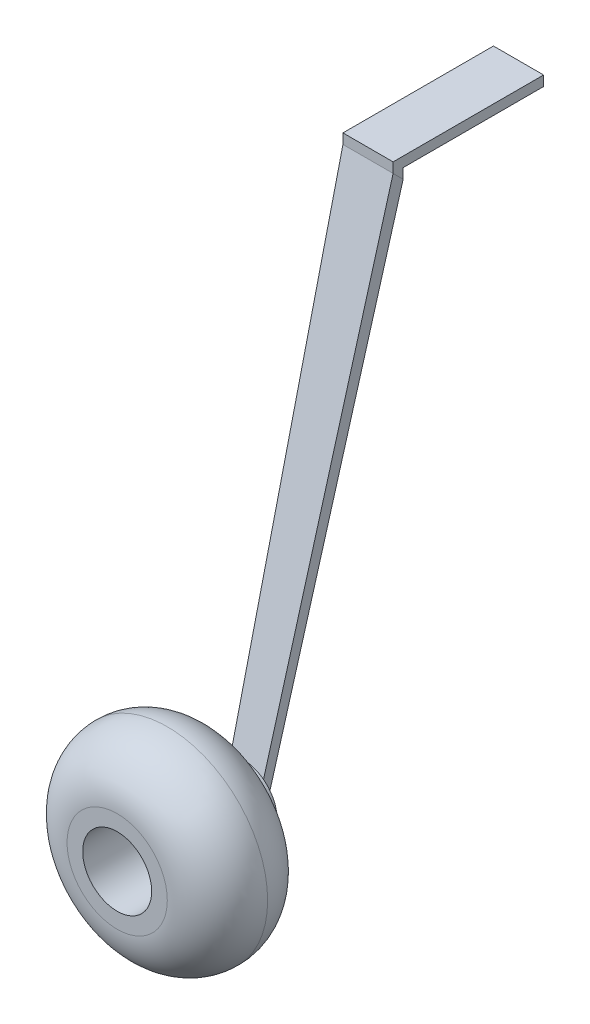
ISO-10303-21;
HEADER;
FILE_DESCRIPTION(('STEP AP214'),'2;1');
FILE_NAME('part.step','',(''),(''),'','','');
FILE_SCHEMA(('AUTOMOTIVE_DESIGN { 1 0 10303 214 1 1 1 1 }'));
ENDSEC;
DATA;
#1=APPLICATION_CONTEXT('core data for automotive mechanical design processes');
#2=APPLICATION_PROTOCOL_DEFINITION('international standard','automotive_design',2000,#1);
#3=PRODUCT_CONTEXT('',#1,'mechanical');
#4=PRODUCT('Part','Part','',(#3));
#5=PRODUCT_RELATED_PRODUCT_CATEGORY('part','',(#4));
#6=PRODUCT_DEFINITION_FORMATION('','',#4);
#7=PRODUCT_DEFINITION_CONTEXT('part definition',#1,'design');
#8=PRODUCT_DEFINITION('design','',#6,#7);
#9=PRODUCT_DEFINITION_SHAPE('','',#8);
#10=(LENGTH_UNIT() NAMED_UNIT(*) SI_UNIT(.MILLI.,.METRE.));
#11=(NAMED_UNIT(*) PLANE_ANGLE_UNIT() SI_UNIT($,.RADIAN.));
#12=(NAMED_UNIT(*) SI_UNIT($,.STERADIAN.) SOLID_ANGLE_UNIT());
#13=UNCERTAINTY_MEASURE_WITH_UNIT(LENGTH_MEASURE(1.E-05),#10,'distance_accuracy_value','');
#14=(GEOMETRIC_REPRESENTATION_CONTEXT(3) GLOBAL_UNCERTAINTY_ASSIGNED_CONTEXT((#13)) GLOBAL_UNIT_ASSIGNED_CONTEXT((#10,
#11,#12)) REPRESENTATION_CONTEXT('',''));
#15=CARTESIAN_POINT('',(0.,0.,0.));
#16=DIRECTION('',(0.,0.,1.));
#17=DIRECTION('',(1.,0.,0.));
#18=AXIS2_PLACEMENT_3D('',#15,#16,#17);
#19=CARTESIAN_POINT('',(0.,0.,35.));
#20=DIRECTION('',(0.,0.,-1.));
#21=DIRECTION('',(1.,0.,0.));
#22=AXIS2_PLACEMENT_3D('',#19,#20,#21);
#23=PLANE('',#22);
#24=CARTESIAN_POINT('',(0.,0.,35.));
#25=DIRECTION('',(0.,0.,1.));
#26=DIRECTION('',(1.,0.,0.));
#27=AXIS2_PLACEMENT_3D('',#24,#25,#26);
#28=CIRCLE('',#27,6.87563698641834);
#29=CARTESIAN_POINT('',(6.87563698641834,0.,35.));
#30=VERTEX_POINT('',#29);
#31=EDGE_CURVE('E12',#30,#30,#28,.T.);
#32=ORIENTED_EDGE('',*,*,#31,.F.);
#33=EDGE_LOOP('',(#32));
#34=FACE_BOUND('',#33,.T.);
#35=DIRECTION('',(1.,0.,0.));
#36=VECTOR('',#35,1.);
#37=CARTESIAN_POINT('',(-3.32337252316547,-1.61552830987186,35.));
#38=LINE('',#37,#36);
#39=CARTESIAN_POINT('',(-3.32337252316547,-1.61552830987186,35.));
#40=VERTEX_POINT('',#39);
#41=CARTESIAN_POINT('',(3.32337252316547,-1.61552830987186,35.));
#42=VERTEX_POINT('',#41);
#43=EDGE_CURVE('E244',#40,#42,#38,.T.);
#44=ORIENTED_EDGE('',*,*,#43,.T.);
#45=DIRECTION('',(0.,1.,0.));
#46=VECTOR('',#45,1.);
#47=CARTESIAN_POINT('',(3.32337252316547,-1.61552830987186,35.));
#48=LINE('',#47,#46);
#49=CARTESIAN_POINT('',(3.32337252316547,1.61552830987186,35.));
#50=VERTEX_POINT('',#49);
#51=EDGE_CURVE('E248',#42,#50,#48,.T.);
#52=ORIENTED_EDGE('',*,*,#51,.T.);
#53=DIRECTION('',(1.,0.,0.));
#54=VECTOR('',#53,1.);
#55=CARTESIAN_POINT('',(0.,1.61552830987186,35.));
#56=LINE('',#55,#54);
#57=CARTESIAN_POINT('',(-3.32337252316547,1.61552830987187,35.));
#58=VERTEX_POINT('',#57);
#59=EDGE_CURVE('E256',#58,#50,#56,.T.);
#60=ORIENTED_EDGE('',*,*,#59,.F.);
#61=DIRECTION('',(0.,1.,0.));
#62=VECTOR('',#61,1.);
#63=CARTESIAN_POINT('',(-3.32337252316547,-1.61552830987186,35.));
#64=LINE('',#63,#62);
#65=EDGE_CURVE('E261',#40,#58,#64,.T.);
#66=ORIENTED_EDGE('',*,*,#65,.F.);
#67=EDGE_LOOP('',(#44,#52,#60,#66));
#68=FACE_BOUND('',#67,.T.);
#69=ADVANCED_FACE('F63',(#34,#68),#23,.T.);
#70=CARTESIAN_POINT('',(0.,0.,35.));
#71=DIRECTION('',(0.,0.,1.));
#72=DIRECTION('',(-1.,0.,0.));
#73=AXIS2_PLACEMENT_3D('',#70,#71,#72);
#74=CYLINDRICAL_SURFACE('',#73,6.87563698641834);
#75=ORIENTED_EDGE('',*,*,#31,.T.);
#76=EDGE_LOOP('',(#75));
#77=FACE_BOUND('',#76,.T.);
#78=CARTESIAN_POINT('',(0.,0.,40.));
#79=DIRECTION('',(0.,0.,1.));
#80=DIRECTION('',(1.,0.,0.));
#81=AXIS2_PLACEMENT_3D('',#78,#79,#80);
#82=CIRCLE('',#81,6.87563698641834);
#83=CARTESIAN_POINT('',(6.87563698641834,0.,40.));
#84=VERTEX_POINT('',#83);
#85=EDGE_CURVE('E75',#84,#84,#82,.T.);
#86=ORIENTED_EDGE('',*,*,#85,.F.);
#87=EDGE_LOOP('',(#86));
#88=FACE_BOUND('',#87,.T.);
#89=ADVANCED_FACE('F65',(#77,#88),#74,.T.);
#90=CARTESIAN_POINT('',(0.,0.,40.));
#91=DIRECTION('',(0.,0.,-1.));
#92=DIRECTION('',(1.,0.,0.));
#93=AXIS2_PLACEMENT_3D('',#90,#91,#92);
#94=PLANE('',#93);
#95=ORIENTED_EDGE('',*,*,#85,.T.);
#96=EDGE_LOOP('',(#95));
#97=FACE_BOUND('',#96,.T.);
#98=ADVANCED_FACE('F379',(#97),#94,.F.);
#99=CARTESIAN_POINT('',(-3.32337252316547,-1.61552830987186,33.));
#100=DIRECTION('',(-1.,0.,0.));
#101=DIRECTION('',(0.,0.,-1.));
#102=AXIS2_PLACEMENT_3D('',#99,#100,#101);
#103=PLANE('',#102);
#104=ORIENTED_EDGE('',*,*,#65,.T.);
#105=DIRECTION('',(0.,0.,-1.));
#106=VECTOR('',#105,1.);
#107=CARTESIAN_POINT('',(-3.32337252316547,1.61552830987186,33.));
#108=LINE('',#107,#106);
#109=CARTESIAN_POINT('',(-3.32337252316547,1.61552830987185,33.));
#110=VERTEX_POINT('',#109);
#111=EDGE_CURVE('E242',#110,#58,#108,.F.);
#112=ORIENTED_EDGE('',*,*,#111,.F.);
#113=DIRECTION('',(0.,1.,0.));
#114=VECTOR('',#113,1.);
#115=CARTESIAN_POINT('',(-3.32337252316547,-1.61552830987186,33.));
#116=LINE('',#115,#114);
#117=CARTESIAN_POINT('',(-3.32337252316547,-1.61552830987186,33.));
#118=VERTEX_POINT('',#117);
#119=EDGE_CURVE('E247',#118,#110,#116,.T.);
#120=ORIENTED_EDGE('',*,*,#119,.F.);
#121=DIRECTION('',(0.,0.,1.));
#122=VECTOR('',#121,1.);
#123=CARTESIAN_POINT('',(-3.32337252316547,-1.61552830987186,33.));
#124=LINE('',#123,#122);
#125=EDGE_CURVE('E249',#118,#40,#124,.T.);
#126=ORIENTED_EDGE('',*,*,#125,.T.);
#127=EDGE_LOOP('',(#104,#112,#120,#126));
#128=FACE_BOUND('',#127,.T.);
#129=ADVANCED_FACE('F365',(#128),#103,.T.);
#130=CARTESIAN_POINT('',(-3.32337252316547,-1.61552830987186,33.));
#131=DIRECTION('',(0.,1.,0.));
#132=DIRECTION('',(0.,0.,-1.));
#133=AXIS2_PLACEMENT_3D('',#130,#131,#132);
#134=PLANE('',#133);
#135=ORIENTED_EDGE('',*,*,#43,.F.);
#136=ORIENTED_EDGE('',*,*,#125,.F.);
#137=DIRECTION('',(1.,0.,0.));
#138=VECTOR('',#137,1.);
#139=CARTESIAN_POINT('',(-3.32337252316547,-1.61552830987186,33.));
#140=LINE('',#139,#138);
#141=CARTESIAN_POINT('',(3.32337252316547,-1.61552830987186,33.));
#142=VERTEX_POINT('',#141);
#143=EDGE_CURVE('E235',#118,#142,#140,.T.);
#144=ORIENTED_EDGE('',*,*,#143,.T.);
#145=DIRECTION('',(0.,0.,1.));
#146=VECTOR('',#145,1.);
#147=CARTESIAN_POINT('',(3.32337252316547,-1.61552830987186,33.));
#148=LINE('',#147,#146);
#149=EDGE_CURVE('E111',#142,#42,#148,.T.);
#150=ORIENTED_EDGE('',*,*,#149,.T.);
#151=EDGE_LOOP('',(#135,#136,#144,#150));
#152=FACE_BOUND('',#151,.T.);
#153=ADVANCED_FACE('F371',(#152),#134,.F.);
#154=CARTESIAN_POINT('',(3.32337252316547,-1.61552830987186,33.));
#155=DIRECTION('',(-1.,0.,0.));
#156=DIRECTION('',(0.,0.,-1.));
#157=AXIS2_PLACEMENT_3D('',#154,#155,#156);
#158=PLANE('',#157);
#159=ORIENTED_EDGE('',*,*,#51,.F.);
#160=ORIENTED_EDGE('',*,*,#149,.F.);
#161=DIRECTION('',(0.,1.,0.));
#162=VECTOR('',#161,1.);
#163=CARTESIAN_POINT('',(3.32337252316547,-1.61552830987186,33.));
#164=LINE('',#163,#162);
#165=CARTESIAN_POINT('',(3.32337252316547,1.61552830987186,33.));
#166=VERTEX_POINT('',#165);
#167=EDGE_CURVE('E243',#142,#166,#164,.T.);
#168=ORIENTED_EDGE('',*,*,#167,.T.);
#169=DIRECTION('',(0.,0.,-1.));
#170=VECTOR('',#169,1.);
#171=CARTESIAN_POINT('',(3.32337252316547,1.61552830987186,33.));
#172=LINE('',#171,#170);
#173=EDGE_CURVE('E187',#166,#50,#172,.F.);
#174=ORIENTED_EDGE('',*,*,#173,.T.);
#175=EDGE_LOOP('',(#159,#160,#168,#174));
#176=FACE_BOUND('',#175,.T.);
#177=ADVANCED_FACE('F369',(#176),#158,.F.);
#178=CARTESIAN_POINT('',(0.,0.,33.));
#179=DIRECTION('',(0.,0.,1.));
#180=DIRECTION('',(-1.,0.,0.));
#181=AXIS2_PLACEMENT_3D('',#178,#179,#180);
#182=PLANE('',#181);
#183=ORIENTED_EDGE('',*,*,#119,.T.);
#184=DIRECTION('',(1.,0.,0.));
#185=VECTOR('',#184,1.);
#186=CARTESIAN_POINT('',(0.,1.61552830987186,33.));
#187=LINE('',#186,#185);
#188=EDGE_CURVE('E258',#110,#166,#187,.T.);
#189=ORIENTED_EDGE('',*,*,#188,.T.);
#190=ORIENTED_EDGE('',*,*,#167,.F.);
#191=ORIENTED_EDGE('',*,*,#143,.F.);
#192=EDGE_LOOP('',(#183,#189,#190,#191));
#193=FACE_BOUND('',#192,.T.);
#194=ADVANCED_FACE('F213',(#193),#182,.F.);
#195=CARTESIAN_POINT('',(0.,18.3289163667286,30.6649168263873));
#196=DIRECTION('',(0.,-0.251069747404583,-0.967968998438586));
#197=DIRECTION('',(0.,-0.967968998438586,0.251069747404583));
#198=AXIS2_PLACEMENT_3D('',#195,#196,#197);
#199=PLANE('',#198);
#200=DIRECTION('',(-0.0168356310439238,0.967831808889454,-0.251034163470074));
#201=VECTOR('',#200,1.);
#202=CARTESIAN_POINT('',(-3.32337252316547,1.61552830987186,35.));
#203=LINE('',#202,#201);
#204=CARTESIAN_POINT('',(-4.99999999999999,98.,10.));
#205=VERTEX_POINT('',#204);
#206=EDGE_CURVE('E84',#58,#205,#203,.T.);
#207=ORIENTED_EDGE('',*,*,#206,.F.);
#208=ORIENTED_EDGE('',*,*,#59,.T.);
#209=DIRECTION('',(0.016835631043924,0.967831808889454,-0.251034163470074));
#210=VECTOR('',#209,1.);
#211=CARTESIAN_POINT('',(3.32337252316547,1.61552830987186,35.));
#212=LINE('',#211,#210);
#213=CARTESIAN_POINT('',(5.00000000000002,98.,10.));
#214=VERTEX_POINT('',#213);
#215=EDGE_CURVE('E190',#50,#214,#212,.T.);
#216=ORIENTED_EDGE('',*,*,#215,.T.);
#217=CARTESIAN_POINT('',(5.00000000000002,98.,9.99999999999998));
#218=DIRECTION('',(-1.,0.,0.));
#219=VECTOR('',#218,1.);
#220=LINE('',#217,#219);
#221=EDGE_CURVE('E199',#214,#205,#220,.T.);
#222=ORIENTED_EDGE('',*,*,#221,.T.);
#223=EDGE_LOOP('',(#207,#208,#216,#222));
#224=FACE_BOUND('',#223,.T.);
#225=ADVANCED_FACE('F204',(#224),#199,.F.);
#226=CARTESIAN_POINT('',(3.32337252316547,1.61552830987186,33.));
#227=CARTESIAN_POINT('',(5.,96.,8.00000000000001));
#228=CARTESIAN_POINT('',(3.32337252316547,1.61552830987186,33.3333333333334));
#229=CARTESIAN_POINT('',(5.,96.3333333333333,8.33333333333331));
#230=CARTESIAN_POINT('',(3.32337252316547,1.61552830987186,33.6666666666668));
#231=CARTESIAN_POINT('',(5.,96.6666666666666,8.66666666666663));
#232=CARTESIAN_POINT('',(3.32337252316547,1.61552830987186,34.3333333333334));
#233=CARTESIAN_POINT('',(5.,97.3333333333333,9.3333333333333));
#234=CARTESIAN_POINT('',(3.32337252316547,1.61552830987186,34.6666666666667));
#235=CARTESIAN_POINT('',(5.,97.6666666666666,9.66666666666665));
#236=CARTESIAN_POINT('',(3.32337252316547,1.61552830987186,35.));
#237=CARTESIAN_POINT('',(5.,98.,10.));
#238=B_SPLINE_SURFACE_WITH_KNOTS('',3,1,((#226,#227),(#228,#229),(#230,#231),(#232,#233),(#234,
#235),(#236,#237)),.UNSPECIFIED.,.F.,.F.,.F.,(4,2,4),(2,2),(0.,0.5,1.),(0.,1.),.UNSPECIFIED.);
#239=DIRECTION('',(0.017169118676803,0.96652250907558,-0.25600675931332));
#240=VECTOR('',#239,1.);
#241=CARTESIAN_POINT('',(3.32337252316547,1.61552830987186,33.));
#242=LINE('',#241,#240);
#243=CARTESIAN_POINT('',(5.,96.,8.00000000000001));
#244=VERTEX_POINT('',#243);
#245=EDGE_CURVE('E170',#166,#244,#242,.T.);
#246=CARTESIAN_POINT('',(5.,96.,8.00000000000001));
#247=CARTESIAN_POINT('',(5.,96.3333333333333,8.33333333333331));
#248=CARTESIAN_POINT('',(5.,96.6666666666666,8.66666666666663));
#249=CARTESIAN_POINT('',(5.,97.3333333333333,9.3333333333333));
#250=CARTESIAN_POINT('',(5.,97.6666666666666,9.66666666666665));
#251=CARTESIAN_POINT('',(5.,98.,10.));
#252=B_SPLINE_CURVE_WITH_KNOTS('',3,(#246,#247,#248,#249,#250,#251),.UNSPECIFIED.,.F.,.F.,(4,2,
4),(0.,0.5,1.),.UNSPECIFIED.);
#253=EDGE_CURVE('E173',#214,#244,#252,.F.);
#254=ORIENTED_EDGE('',*,*,#173,.F.);
#255=ORIENTED_EDGE('',*,*,#245,.T.);
#256=ORIENTED_EDGE('',*,*,#253,.F.);
#257=ORIENTED_EDGE('',*,*,#215,.F.);
#258=EDGE_LOOP('',(#254,#255,#256,#257));
#259=FACE_BOUND('',#258,.T.);
#260=ADVANCED_FACE('F185',(#259),#238,.F.);
#261=CARTESIAN_POINT('',(-3.32337252316547,1.61552830987186,35.));
#262=CARTESIAN_POINT('',(-4.99999999999999,98.,10.));
#263=CARTESIAN_POINT('',(-3.32337252316547,1.61552830987186,34.6666666666666));
#264=CARTESIAN_POINT('',(-4.99999999999999,97.6666666666666,9.66666666666664));
#265=CARTESIAN_POINT('',(-3.32337252316547,1.61552830987186,34.3333333333333));
#266=CARTESIAN_POINT('',(-4.99999999999999,97.3333333333333,9.3333333333333));
#267=CARTESIAN_POINT('',(-3.32337252316547,1.61552830987186,33.6666666666666));
#268=CARTESIAN_POINT('',(-4.99999999999999,96.6666666666666,8.66666666666663));
#269=CARTESIAN_POINT('',(-3.32337252316547,1.61552830987186,33.3333333333333));
#270=CARTESIAN_POINT('',(-4.99999999999999,96.3333333333333,8.33333333333331));
#271=CARTESIAN_POINT('',(-3.32337252316547,1.61552830987186,33.));
#272=CARTESIAN_POINT('',(-4.99999999999999,96.,8.00000000000001));
#273=B_SPLINE_SURFACE_WITH_KNOTS('',3,1,((#261,#262),(#263,#264),(#265,#266),(#267,#268),(#269,
#270),(#271,#272)),.UNSPECIFIED.,.F.,.F.,.F.,(4,2,4),(2,2),(0.,0.5,1.),(0.,1.),.UNSPECIFIED.);
#274=CARTESIAN_POINT('',(-4.99999999999999,98.,10.));
#275=CARTESIAN_POINT('',(-4.99999999999999,97.6666666666666,9.66666666666664));
#276=CARTESIAN_POINT('',(-4.99999999999999,97.3333333333333,9.3333333333333));
#277=CARTESIAN_POINT('',(-4.99999999999999,96.6666666666666,8.66666666666663));
#278=CARTESIAN_POINT('',(-4.99999999999999,96.3333333333333,8.33333333333331));
#279=CARTESIAN_POINT('',(-4.99999999999999,96.,8.00000000000001));
#280=B_SPLINE_CURVE_WITH_KNOTS('',3,(#274,#275,#276,#277,#278,#279),.UNSPECIFIED.,.F.,.F.,(4,2,
4),(0.,0.5,1.),.UNSPECIFIED.);
#281=CARTESIAN_POINT('',(-4.99999999999999,96.,8.00000000000001));
#282=VERTEX_POINT('',#281);
#283=EDGE_CURVE('E172',#282,#205,#280,.F.);
#284=DIRECTION('',(-0.0171691186768029,0.96652250907558,-0.25600675931332));
#285=VECTOR('',#284,1.);
#286=CARTESIAN_POINT('',(-4.16168626158273,48.8077641549359,20.5));
#287=LINE('',#286,#285);
#288=EDGE_CURVE('E101',#110,#282,#287,.T.);
#289=ORIENTED_EDGE('',*,*,#111,.T.);
#290=ORIENTED_EDGE('',*,*,#206,.T.);
#291=ORIENTED_EDGE('',*,*,#283,.F.);
#292=ORIENTED_EDGE('',*,*,#288,.F.);
#293=EDGE_LOOP('',(#289,#290,#291,#292));
#294=FACE_BOUND('',#293,.T.);
#295=ADVANCED_FACE('F221',(#294),#273,.F.);
#296=CARTESIAN_POINT('',(0.,18.174087747841,28.6140668212002));
#297=DIRECTION('',(0.,0.256044500319133,0.966664995671368));
#298=DIRECTION('',(0.,0.966664995671368,-0.256044500319133));
#299=AXIS2_PLACEMENT_3D('',#296,#297,#298);
#300=PLANE('',#299);
#301=ORIENTED_EDGE('',*,*,#245,.F.);
#302=ORIENTED_EDGE('',*,*,#188,.F.);
#303=ORIENTED_EDGE('',*,*,#288,.T.);
#304=CARTESIAN_POINT('',(-4.99999999999999,96.,8.00000000000001));
#305=DIRECTION('',(1.,0.,0.));
#306=VECTOR('',#305,1.);
#307=LINE('',#304,#306);
#308=EDGE_CURVE('E156',#282,#244,#307,.T.);
#309=ORIENTED_EDGE('',*,*,#308,.T.);
#310=EDGE_LOOP('',(#301,#302,#303,#309));
#311=FACE_BOUND('',#310,.T.);
#312=ADVANCED_FACE('F168',(#311),#300,.F.);
#313=CARTESIAN_POINT('',(0.,98.,-40.));
#314=DIRECTION('',(0.,-1.,0.));
#315=DIRECTION('',(0.,0.,1.));
#316=AXIS2_PLACEMENT_3D('',#313,#314,#315);
#317=PLANE('',#316);
#318=DIRECTION('',(0.,0.,1.));
#319=VECTOR('',#318,1.);
#320=CARTESIAN_POINT('',(-4.99999999999999,98.,-9.99999999999999));
#321=LINE('',#320,#319);
#322=CARTESIAN_POINT('',(-4.99999999999999,98.,-20.));
#323=VERTEX_POINT('',#322);
#324=CARTESIAN_POINT('',(-5.,98.,8.00000000000001));
#325=VERTEX_POINT('',#324);
#326=EDGE_CURVE('E331',#323,#325,#321,.T.);
#327=ORIENTED_EDGE('',*,*,#326,.F.);
#328=DIRECTION('',(1.,0.,0.));
#329=VECTOR('',#328,1.);
#330=CARTESIAN_POINT('',(-4.99999999999999,98.,-20.));
#331=LINE('',#330,#329);
#332=CARTESIAN_POINT('',(5.,98.,-20.));
#333=VERTEX_POINT('',#332);
#334=EDGE_CURVE('E328',#323,#333,#331,.T.);
#335=ORIENTED_EDGE('',*,*,#334,.T.);
#336=DIRECTION('',(0.,0.,1.));
#337=VECTOR('',#336,1.);
#338=CARTESIAN_POINT('',(5.,98.,-20.));
#339=LINE('',#338,#337);
#340=CARTESIAN_POINT('',(5.,98.,8.00000000000001));
#341=VERTEX_POINT('',#340);
#342=EDGE_CURVE('E336',#333,#341,#339,.T.);
#343=ORIENTED_EDGE('',*,*,#342,.T.);
#344=DIRECTION('',(1.,0.,0.));
#345=VECTOR('',#344,1.);
#346=CARTESIAN_POINT('',(0.,98.,8.00000000000001));
#347=LINE('',#346,#345);
#348=EDGE_CURVE('E159',#325,#341,#347,.T.);
#349=ORIENTED_EDGE('',*,*,#348,.F.);
#350=EDGE_LOOP('',(#327,#335,#343,#349));
#351=FACE_BOUND('',#350,.T.);
#352=ADVANCED_FACE('F284',(#351),#317,.T.);
#353=CARTESIAN_POINT('',(-4.99999999999999,98.,-20.));
#354=DIRECTION('',(0.,0.,-1.));
#355=DIRECTION('',(1.,0.,0.));
#356=AXIS2_PLACEMENT_3D('',#353,#354,#355);
#357=PLANE('',#356);
#358=DIRECTION('',(1.,0.,0.));
#359=VECTOR('',#358,1.);
#360=CARTESIAN_POINT('',(-4.99999999999999,100.,-20.));
#361=LINE('',#360,#359);
#362=CARTESIAN_POINT('',(-4.99999999999999,100.,-20.));
#363=VERTEX_POINT('',#362);
#364=CARTESIAN_POINT('',(5.,100.,-20.));
#365=VERTEX_POINT('',#364);
#366=EDGE_CURVE('E347',#363,#365,#361,.T.);
#367=ORIENTED_EDGE('',*,*,#366,.T.);
#368=DIRECTION('',(0.,1.,0.));
#369=VECTOR('',#368,1.);
#370=CARTESIAN_POINT('',(5.,98.,-20.));
#371=LINE('',#370,#369);
#372=EDGE_CURVE('E350',#333,#365,#371,.T.);
#373=ORIENTED_EDGE('',*,*,#372,.F.);
#374=ORIENTED_EDGE('',*,*,#334,.F.);
#375=DIRECTION('',(0.,1.,0.));
#376=VECTOR('',#375,1.);
#377=CARTESIAN_POINT('',(-4.99999999999999,98.,-20.));
#378=LINE('',#377,#376);
#379=EDGE_CURVE('E315',#323,#363,#378,.T.);
#380=ORIENTED_EDGE('',*,*,#379,.T.);
#381=EDGE_LOOP('',(#367,#373,#374,#380));
#382=FACE_BOUND('',#381,.T.);
#383=ADVANCED_FACE('F287',(#382),#357,.T.);
#384=CARTESIAN_POINT('',(-4.99999999999999,98.,-9.99999999999999));
#385=DIRECTION('',(-1.,0.,0.));
#386=DIRECTION('',(0.,0.,-1.));
#387=AXIS2_PLACEMENT_3D('',#384,#385,#386);
#388=PLANE('',#387);
#389=ORIENTED_EDGE('',*,*,#283,.T.);
#390=DIRECTION('',(0.,1.,0.));
#391=VECTOR('',#390,1.);
#392=CARTESIAN_POINT('',(-5.,98.,10.));
#393=LINE('',#392,#391);
#394=CARTESIAN_POINT('',(-5.,100.,10.));
#395=VERTEX_POINT('',#394);
#396=EDGE_CURVE('E307',#205,#395,#393,.T.);
#397=ORIENTED_EDGE('',*,*,#396,.T.);
#398=DIRECTION('',(0.,0.,-1.));
#399=VECTOR('',#398,1.);
#400=CARTESIAN_POINT('',(-4.99999999999999,100.,-9.99999999999999));
#401=LINE('',#400,#399);
#402=EDGE_CURVE('E345',#395,#363,#401,.T.);
#403=ORIENTED_EDGE('',*,*,#402,.T.);
#404=ORIENTED_EDGE('',*,*,#379,.F.);
#405=ORIENTED_EDGE('',*,*,#326,.T.);
#406=DIRECTION('',(0.,1.,0.));
#407=VECTOR('',#406,1.);
#408=CARTESIAN_POINT('',(-5.,96.,8.00000000000001));
#409=LINE('',#408,#407);
#410=EDGE_CURVE('E164',#282,#325,#409,.T.);
#411=ORIENTED_EDGE('',*,*,#410,.F.);
#412=EDGE_LOOP('',(#389,#397,#403,#404,#405,#411));
#413=FACE_BOUND('',#412,.T.);
#414=ADVANCED_FACE('F294',(#413),#388,.T.);
#415=CARTESIAN_POINT('',(-5.,98.,10.));
#416=DIRECTION('',(0.,0.,-1.));
#417=DIRECTION('',(1.,0.,0.));
#418=AXIS2_PLACEMENT_3D('',#415,#416,#417);
#419=PLANE('',#418);
#420=DIRECTION('',(0.,1.,0.));
#421=VECTOR('',#420,1.);
#422=CARTESIAN_POINT('',(5.,98.,10.));
#423=LINE('',#422,#421);
#424=CARTESIAN_POINT('',(5.,100.,10.));
#425=VERTEX_POINT('',#424);
#426=EDGE_CURVE('E179',#214,#425,#423,.T.);
#427=ORIENTED_EDGE('',*,*,#426,.T.);
#428=DIRECTION('',(1.,0.,0.));
#429=VECTOR('',#428,1.);
#430=CARTESIAN_POINT('',(-5.,100.,10.));
#431=LINE('',#430,#429);
#432=EDGE_CURVE('E342',#395,#425,#431,.T.);
#433=ORIENTED_EDGE('',*,*,#432,.F.);
#434=ORIENTED_EDGE('',*,*,#396,.F.);
#435=ORIENTED_EDGE('',*,*,#221,.F.);
#436=EDGE_LOOP('',(#427,#433,#434,#435));
#437=FACE_BOUND('',#436,.T.);
#438=ADVANCED_FACE('F298',(#437),#419,.F.);
#439=CARTESIAN_POINT('',(5.,98.,-9.99999999999999));
#440=DIRECTION('',(1.,0.,0.));
#441=DIRECTION('',(0.,0.,1.));
#442=AXIS2_PLACEMENT_3D('',#439,#440,#441);
#443=PLANE('',#442);
#444=ORIENTED_EDGE('',*,*,#253,.T.);
#445=DIRECTION('',(0.,1.,0.));
#446=VECTOR('',#445,1.);
#447=CARTESIAN_POINT('',(5.,96.,8.00000000000001));
#448=LINE('',#447,#446);
#449=EDGE_CURVE('E153',#244,#341,#448,.T.);
#450=ORIENTED_EDGE('',*,*,#449,.T.);
#451=ORIENTED_EDGE('',*,*,#342,.F.);
#452=ORIENTED_EDGE('',*,*,#372,.T.);
#453=DIRECTION('',(0.,0.,1.));
#454=VECTOR('',#453,1.);
#455=CARTESIAN_POINT('',(5.,100.,-9.99999999999999));
#456=LINE('',#455,#454);
#457=EDGE_CURVE('E340',#365,#425,#456,.T.);
#458=ORIENTED_EDGE('',*,*,#457,.T.);
#459=ORIENTED_EDGE('',*,*,#426,.F.);
#460=EDGE_LOOP('',(#444,#450,#451,#452,#458,#459));
#461=FACE_BOUND('',#460,.T.);
#462=ADVANCED_FACE('F177',(#461),#443,.T.);
#463=CARTESIAN_POINT('',(0.,100.,-40.));
#464=DIRECTION('',(0.,-1.,0.));
#465=DIRECTION('',(0.,0.,1.));
#466=AXIS2_PLACEMENT_3D('',#463,#464,#465);
#467=PLANE('',#466);
#468=ORIENTED_EDGE('',*,*,#366,.F.);
#469=ORIENTED_EDGE('',*,*,#402,.F.);
#470=ORIENTED_EDGE('',*,*,#432,.T.);
#471=ORIENTED_EDGE('',*,*,#457,.F.);
#472=EDGE_LOOP('',(#468,#469,#470,#471));
#473=FACE_BOUND('',#472,.T.);
#474=ADVANCED_FACE('F283',(#473),#467,.F.);
#475=CARTESIAN_POINT('',(0.,96.,8.00000000000001));
#476=DIRECTION('',(0.,0.,-1.));
#477=DIRECTION('',(1.,0.,0.));
#478=AXIS2_PLACEMENT_3D('',#475,#476,#477);
#479=PLANE('',#478);
#480=ORIENTED_EDGE('',*,*,#348,.T.);
#481=ORIENTED_EDGE('',*,*,#449,.F.);
#482=ORIENTED_EDGE('',*,*,#308,.F.);
#483=ORIENTED_EDGE('',*,*,#410,.T.);
#484=EDGE_LOOP('',(#480,#481,#482,#483));
#485=FACE_BOUND('',#484,.T.);
#486=ADVANCED_FACE('F155',(#485),#479,.T.);
#487=CLOSED_SHELL('',(#69,#89,#98,#129,#153,#177,#194,#225,#260,#295,#312,#352,#383,#414,#438,
#462,#474,#486));
#488=MANIFOLD_SOLID_BREP('B2',#487);
#489=CARTESIAN_POINT('',(0.,0.,40.));
#490=DIRECTION('',(0.,0.,-1.));
#491=DIRECTION('',(1.,0.,0.));
#492=AXIS2_PLACEMENT_3D('',#489,#490,#491);
#493=PLANE('',#492);
#494=CARTESIAN_POINT('',(0.,0.,40.));
#495=DIRECTION('',(0.,0.,1.));
#496=DIRECTION('',(1.,0.,0.));
#497=AXIS2_PLACEMENT_3D('',#494,#495,#496);
#498=CIRCLE('',#497,9.98814712973096);
#499=CARTESIAN_POINT('',(9.98814712973096,0.,40.));
#500=VERTEX_POINT('',#499);
#501=EDGE_CURVE('E62',#500,#500,#498,.T.);
#502=ORIENTED_EDGE('',*,*,#501,.F.);
#503=EDGE_LOOP('',(#502));
#504=FACE_BOUND('',#503,.T.);
#505=CARTESIAN_POINT('',(0.,0.,40.));
#506=DIRECTION('',(0.,0.,1.));
#507=DIRECTION('',(1.,0.,0.));
#508=AXIS2_PLACEMENT_3D('',#505,#506,#507);
#509=CIRCLE('',#508,6.87563698641834);
#510=CARTESIAN_POINT('',(6.87563698641834,0.,40.));
#511=VERTEX_POINT('',#510);
#512=EDGE_CURVE('E645',#511,#511,#509,.T.);
#513=ORIENTED_EDGE('',*,*,#512,.T.);
#514=EDGE_LOOP('',(#513));
#515=FACE_BOUND('',#514,.T.);
#516=ADVANCED_FACE('F631',(#504,#515),#493,.T.);
#517=CARTESIAN_POINT('',(0.,0.,60.));
#518=DIRECTION('',(0.,0.,-1.));
#519=DIRECTION('',(1.,0.,0.));
#520=AXIS2_PLACEMENT_3D('',#517,#518,#519);
#521=PLANE('',#520);
#522=CARTESIAN_POINT('',(0.,0.,60.));
#523=DIRECTION('',(0.,0.,1.));
#524=DIRECTION('',(1.,0.,0.));
#525=AXIS2_PLACEMENT_3D('',#522,#523,#524);
#526=CIRCLE('',#525,9.98814712973096);
#527=CARTESIAN_POINT('',(9.98814712973096,0.,60.));
#528=VERTEX_POINT('',#527);
#529=EDGE_CURVE('E640',#528,#528,#526,.F.);
#530=ORIENTED_EDGE('',*,*,#529,.F.);
#531=EDGE_LOOP('',(#530));
#532=FACE_BOUND('',#531,.T.);
#533=CARTESIAN_POINT('',(0.,0.,60.));
#534=DIRECTION('',(0.,0.,1.));
#535=DIRECTION('',(1.,0.,0.));
#536=AXIS2_PLACEMENT_3D('',#533,#534,#535);
#537=CIRCLE('',#536,6.87563698641834);
#538=CARTESIAN_POINT('',(6.87563698641834,0.,60.));
#539=VERTEX_POINT('',#538);
#540=EDGE_CURVE('E648',#539,#539,#537,.T.);
#541=ORIENTED_EDGE('',*,*,#540,.F.);
#542=EDGE_LOOP('',(#541));
#543=FACE_BOUND('',#542,.T.);
#544=ADVANCED_FACE('F660',(#532,#543),#521,.F.);
#545=CARTESIAN_POINT('',(0.,0.,40.));
#546=DIRECTION('',(0.,0.,1.));
#547=DIRECTION('',(-1.,0.,0.));
#548=AXIS2_PLACEMENT_3D('',#545,#546,#547);
#549=CYLINDRICAL_SURFACE('',#548,6.87563698641834);
#550=ORIENTED_EDGE('',*,*,#512,.F.);
#551=EDGE_LOOP('',(#550));
#552=FACE_BOUND('',#551,.T.);
#553=ORIENTED_EDGE('',*,*,#540,.T.);
#554=EDGE_LOOP('',(#553));
#555=FACE_BOUND('',#554,.T.);
#556=ADVANCED_FACE('F657',(#552,#555),#549,.F.);
#557=CARTESIAN_POINT('',(0.,0.,50.));
#558=DIRECTION('',(0.,0.,-1.));
#559=DIRECTION('',(1.,0.,0.));
#560=AXIS2_PLACEMENT_3D('',#557,#558,#559);
#561=DEGENERATE_TOROIDAL_SURFACE('',#560,9.98814712973096,10.,.T.);
#562=ORIENTED_EDGE('',*,*,#501,.T.);
#563=EDGE_LOOP('',(#562));
#564=FACE_BOUND('',#563,.T.);
#565=CARTESIAN_POINT('',(0.,0.,50.));
#566=DIRECTION('',(0.,0.,1.));
#567=DIRECTION('',(1.,0.,0.));
#568=AXIS2_PLACEMENT_3D('',#565,#566,#567);
#569=CIRCLE('',#568,19.988147129731);
#570=CARTESIAN_POINT('',(19.988147129731,0.,50.));
#571=VERTEX_POINT('',#570);
#572=EDGE_CURVE('E635',#571,#571,#569,.F.);
#573=ORIENTED_EDGE('',*,*,#572,.T.);
#574=EDGE_LOOP('',(#573));
#575=FACE_BOUND('',#574,.T.);
#576=ADVANCED_FACE('F633',(#564,#575),#561,.T.);
#577=CARTESIAN_POINT('',(0.,0.,50.));
#578=DIRECTION('',(0.,0.,-1.));
#579=DIRECTION('',(1.,0.,0.));
#580=AXIS2_PLACEMENT_3D('',#577,#578,#579);
#581=DEGENERATE_TOROIDAL_SURFACE('',#580,9.98814712973096,10.,.T.);
#582=ORIENTED_EDGE('',*,*,#529,.T.);
#583=EDGE_LOOP('',(#582));
#584=FACE_BOUND('',#583,.T.);
#585=ORIENTED_EDGE('',*,*,#572,.F.);
#586=EDGE_LOOP('',(#585));
#587=FACE_BOUND('',#586,.T.);
#588=ADVANCED_FACE('F673',(#584,#587),#581,.T.);
#589=CLOSED_SHELL('',(#516,#544,#556,#576,#588));
#590=MANIFOLD_SOLID_BREP('B6',#589);
#591=ADVANCED_BREP_SHAPE_REPRESENTATION('',(#18,#488,#590),#14);
#592=SHAPE_DEFINITION_REPRESENTATION(#9,#591);
ENDSEC;
END-ISO-10303-21;
